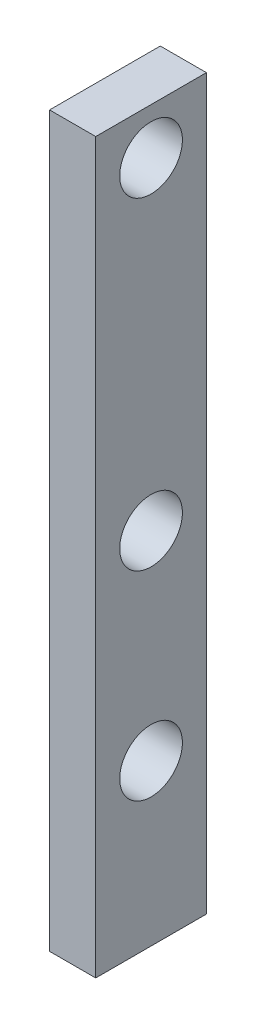
ISO-10303-21;
HEADER;
FILE_DESCRIPTION(('STEP AP214'),'2;1');
FILE_NAME('part.step','',(''),(''),'','','');
FILE_SCHEMA(('AUTOMOTIVE_DESIGN { 1 0 10303 214 1 1 1 1 }'));
ENDSEC;
DATA;
#1=APPLICATION_CONTEXT('core data for automotive mechanical design processes');
#2=APPLICATION_PROTOCOL_DEFINITION('international standard','automotive_design',2000,#1);
#3=PRODUCT_CONTEXT('',#1,'mechanical');
#4=PRODUCT('Part','Part','',(#3));
#5=PRODUCT_RELATED_PRODUCT_CATEGORY('part','',(#4));
#6=PRODUCT_DEFINITION_FORMATION('','',#4);
#7=PRODUCT_DEFINITION_CONTEXT('part definition',#1,'design');
#8=PRODUCT_DEFINITION('design','',#6,#7);
#9=PRODUCT_DEFINITION_SHAPE('','',#8);
#10=(LENGTH_UNIT() NAMED_UNIT(*) SI_UNIT(.MILLI.,.METRE.));
#11=(NAMED_UNIT(*) PLANE_ANGLE_UNIT() SI_UNIT($,.RADIAN.));
#12=(NAMED_UNIT(*) SI_UNIT($,.STERADIAN.) SOLID_ANGLE_UNIT());
#13=UNCERTAINTY_MEASURE_WITH_UNIT(LENGTH_MEASURE(1.E-05),#10,'distance_accuracy_value','');
#14=(GEOMETRIC_REPRESENTATION_CONTEXT(3) GLOBAL_UNCERTAINTY_ASSIGNED_CONTEXT((#13)) GLOBAL_UNIT_ASSIGNED_CONTEXT((#10,
#11,#12)) REPRESENTATION_CONTEXT('',''));
#15=CARTESIAN_POINT('',(0.,0.,0.));
#16=DIRECTION('',(0.,0.,1.));
#17=DIRECTION('',(1.,0.,0.));
#18=AXIS2_PLACEMENT_3D('',#15,#16,#17);
#19=CARTESIAN_POINT('',(2.5,0.,0.));
#20=DIRECTION('',(-1.,0.,0.));
#21=DIRECTION('',(0.,0.,1.));
#22=AXIS2_PLACEMENT_3D('',#19,#20,#21);
#23=PLANE('',#22);
#24=DIRECTION('',(0.,-1.,0.));
#25=VECTOR('',#24,1.);
#26=CARTESIAN_POINT('',(2.5,0.,0.));
#27=LINE('',#26,#25);
#28=CARTESIAN_POINT('',(2.5,39.5,0.));
#29=VERTEX_POINT('',#28);
#30=CARTESIAN_POINT('',(2.5,0.,0.));
#31=VERTEX_POINT('',#30);
#32=EDGE_CURVE('E91',#29,#31,#27,.T.);
#33=ORIENTED_EDGE('',*,*,#32,.T.);
#34=DIRECTION('',(0.,0.,-1.));
#35=VECTOR('',#34,1.);
#36=CARTESIAN_POINT('',(2.5,0.,0.));
#37=LINE('',#36,#35);
#38=CARTESIAN_POINT('',(2.5,0.,-6.));
#39=VERTEX_POINT('',#38);
#40=EDGE_CURVE('E86',#31,#39,#37,.T.);
#41=ORIENTED_EDGE('',*,*,#40,.T.);
#42=DIRECTION('',(0.,1.,0.));
#43=VECTOR('',#42,1.);
#44=CARTESIAN_POINT('',(2.5,0.,-6.));
#45=LINE('',#44,#43);
#46=CARTESIAN_POINT('',(2.5,39.5,-6.));
#47=VERTEX_POINT('',#46);
#48=EDGE_CURVE('E89',#39,#47,#45,.T.);
#49=ORIENTED_EDGE('',*,*,#48,.T.);
#50=DIRECTION('',(0.,0.,1.));
#51=VECTOR('',#50,1.);
#52=CARTESIAN_POINT('',(2.5,39.5,0.));
#53=LINE('',#52,#51);
#54=EDGE_CURVE('E56',#47,#29,#53,.T.);
#55=ORIENTED_EDGE('',*,*,#54,.T.);
#56=EDGE_LOOP('',(#33,#41,#49,#55));
#57=FACE_BOUND('',#56,.T.);
#58=CARTESIAN_POINT('',(2.5,8.7,-3.));
#59=DIRECTION('',(1.,0.,0.));
#60=DIRECTION('',(0.,0.,-1.));
#61=AXIS2_PLACEMENT_3D('',#58,#59,#60);
#62=CIRCLE('',#61,1.7);
#63=CARTESIAN_POINT('',(2.5,8.7,-4.7));
#64=VERTEX_POINT('',#63);
#65=EDGE_CURVE('E106',#64,#64,#62,.T.);
#66=ORIENTED_EDGE('',*,*,#65,.F.);
#67=EDGE_LOOP('',(#66));
#68=FACE_BOUND('',#67,.T.);
#69=CARTESIAN_POINT('',(2.5,19.5,-3.));
#70=DIRECTION('',(1.,0.,0.));
#71=DIRECTION('',(0.,0.,-1.));
#72=AXIS2_PLACEMENT_3D('',#69,#70,#71);
#73=CIRCLE('',#72,1.7);
#74=CARTESIAN_POINT('',(2.5,19.5,-4.7));
#75=VERTEX_POINT('',#74);
#76=EDGE_CURVE('E121',#75,#75,#73,.T.);
#77=ORIENTED_EDGE('',*,*,#76,.F.);
#78=EDGE_LOOP('',(#77));
#79=FACE_BOUND('',#78,.T.);
#80=CARTESIAN_POINT('',(2.5,37.,-3.));
#81=DIRECTION('',(1.,0.,0.));
#82=DIRECTION('',(0.,0.,-1.));
#83=AXIS2_PLACEMENT_3D('',#80,#81,#82);
#84=CIRCLE('',#83,1.7);
#85=CARTESIAN_POINT('',(2.5,37.,-4.7));
#86=VERTEX_POINT('',#85);
#87=EDGE_CURVE('E127',#86,#86,#84,.T.);
#88=ORIENTED_EDGE('',*,*,#87,.F.);
#89=EDGE_LOOP('',(#88));
#90=FACE_BOUND('',#89,.T.);
#91=ADVANCED_FACE('F39',(#57,#68,#79,#90),#23,.F.);
#92=CARTESIAN_POINT('',(0.,0.,0.));
#93=DIRECTION('',(-1.,0.,0.));
#94=DIRECTION('',(0.,0.,1.));
#95=AXIS2_PLACEMENT_3D('',#92,#93,#94);
#96=PLANE('',#95);
#97=CARTESIAN_POINT('',(0.,19.5,-3.));
#98=DIRECTION('',(1.,0.,0.));
#99=DIRECTION('',(0.,0.,-1.));
#100=AXIS2_PLACEMENT_3D('',#97,#98,#99);
#101=CIRCLE('',#100,1.7);
#102=CARTESIAN_POINT('',(0.,19.5,-4.7));
#103=VERTEX_POINT('',#102);
#104=EDGE_CURVE('E124',#103,#103,#101,.T.);
#105=ORIENTED_EDGE('',*,*,#104,.T.);
#106=EDGE_LOOP('',(#105));
#107=FACE_BOUND('',#106,.T.);
#108=DIRECTION('',(0.,-1.,0.));
#109=VECTOR('',#108,1.);
#110=CARTESIAN_POINT('',(0.,0.,0.));
#111=LINE('',#110,#109);
#112=CARTESIAN_POINT('',(0.,39.5,0.));
#113=VERTEX_POINT('',#112);
#114=CARTESIAN_POINT('',(0.,0.,0.));
#115=VERTEX_POINT('',#114);
#116=EDGE_CURVE('E103',#113,#115,#111,.T.);
#117=ORIENTED_EDGE('',*,*,#116,.F.);
#118=DIRECTION('',(0.,0.,1.));
#119=VECTOR('',#118,1.);
#120=CARTESIAN_POINT('',(0.,39.5,0.));
#121=LINE('',#120,#119);
#122=CARTESIAN_POINT('',(0.,39.5,-6.));
#123=VERTEX_POINT('',#122);
#124=EDGE_CURVE('E79',#123,#113,#121,.T.);
#125=ORIENTED_EDGE('',*,*,#124,.F.);
#126=DIRECTION('',(0.,1.,0.));
#127=VECTOR('',#126,1.);
#128=CARTESIAN_POINT('',(0.,0.,-6.));
#129=LINE('',#128,#127);
#130=CARTESIAN_POINT('',(0.,0.,-6.));
#131=VERTEX_POINT('',#130);
#132=EDGE_CURVE('E73',#131,#123,#129,.T.);
#133=ORIENTED_EDGE('',*,*,#132,.F.);
#134=DIRECTION('',(0.,0.,-1.));
#135=VECTOR('',#134,1.);
#136=CARTESIAN_POINT('',(0.,0.,0.));
#137=LINE('',#136,#135);
#138=EDGE_CURVE('E95',#115,#131,#137,.T.);
#139=ORIENTED_EDGE('',*,*,#138,.F.);
#140=EDGE_LOOP('',(#117,#125,#133,#139));
#141=FACE_BOUND('',#140,.T.);
#142=CARTESIAN_POINT('',(0.,8.7,-3.));
#143=DIRECTION('',(1.,0.,0.));
#144=DIRECTION('',(0.,0.,-1.));
#145=AXIS2_PLACEMENT_3D('',#142,#143,#144);
#146=CIRCLE('',#145,1.7);
#147=CARTESIAN_POINT('',(0.,8.7,-4.7));
#148=VERTEX_POINT('',#147);
#149=EDGE_CURVE('E118',#148,#148,#146,.T.);
#150=ORIENTED_EDGE('',*,*,#149,.T.);
#151=EDGE_LOOP('',(#150));
#152=FACE_BOUND('',#151,.T.);
#153=CARTESIAN_POINT('',(0.,37.,-3.));
#154=DIRECTION('',(1.,0.,0.));
#155=DIRECTION('',(0.,0.,-1.));
#156=AXIS2_PLACEMENT_3D('',#153,#154,#155);
#157=CIRCLE('',#156,1.7);
#158=CARTESIAN_POINT('',(0.,37.,-4.7));
#159=VERTEX_POINT('',#158);
#160=EDGE_CURVE('E130',#159,#159,#157,.T.);
#161=ORIENTED_EDGE('',*,*,#160,.T.);
#162=EDGE_LOOP('',(#161));
#163=FACE_BOUND('',#162,.T.);
#164=ADVANCED_FACE('F114',(#107,#141,#152,#163),#96,.T.);
#165=CARTESIAN_POINT('',(2.5,0.,0.));
#166=DIRECTION('',(0.,0.,-1.));
#167=DIRECTION('',(-1.,0.,0.));
#168=AXIS2_PLACEMENT_3D('',#165,#166,#167);
#169=PLANE('',#168);
#170=ORIENTED_EDGE('',*,*,#116,.T.);
#171=DIRECTION('',(-1.,0.,0.));
#172=VECTOR('',#171,1.);
#173=CARTESIAN_POINT('',(2.5,0.,0.));
#174=LINE('',#173,#172);
#175=EDGE_CURVE('E11',#31,#115,#174,.T.);
#176=ORIENTED_EDGE('',*,*,#175,.F.);
#177=ORIENTED_EDGE('',*,*,#32,.F.);
#178=DIRECTION('',(-1.,0.,0.));
#179=VECTOR('',#178,1.);
#180=CARTESIAN_POINT('',(2.5,39.5,0.));
#181=LINE('',#180,#179);
#182=EDGE_CURVE('E99',#29,#113,#181,.T.);
#183=ORIENTED_EDGE('',*,*,#182,.T.);
#184=EDGE_LOOP('',(#170,#176,#177,#183));
#185=FACE_BOUND('',#184,.T.);
#186=ADVANCED_FACE('F41',(#185),#169,.F.);
#187=CARTESIAN_POINT('',(2.5,0.,0.));
#188=DIRECTION('',(0.,1.,0.));
#189=DIRECTION('',(0.,0.,1.));
#190=AXIS2_PLACEMENT_3D('',#187,#188,#189);
#191=PLANE('',#190);
#192=ORIENTED_EDGE('',*,*,#138,.T.);
#193=DIRECTION('',(-1.,0.,0.));
#194=VECTOR('',#193,1.);
#195=CARTESIAN_POINT('',(2.5,0.,-6.));
#196=LINE('',#195,#194);
#197=EDGE_CURVE('E48',#39,#131,#196,.T.);
#198=ORIENTED_EDGE('',*,*,#197,.F.);
#199=ORIENTED_EDGE('',*,*,#40,.F.);
#200=ORIENTED_EDGE('',*,*,#175,.T.);
#201=EDGE_LOOP('',(#192,#198,#199,#200));
#202=FACE_BOUND('',#201,.T.);
#203=ADVANCED_FACE('F94',(#202),#191,.F.);
#204=CARTESIAN_POINT('',(2.5,0.,-6.));
#205=DIRECTION('',(0.,0.,1.));
#206=DIRECTION('',(1.,0.,0.));
#207=AXIS2_PLACEMENT_3D('',#204,#205,#206);
#208=PLANE('',#207);
#209=ORIENTED_EDGE('',*,*,#132,.T.);
#210=DIRECTION('',(-1.,0.,0.));
#211=VECTOR('',#210,1.);
#212=CARTESIAN_POINT('',(2.5,39.5,-6.));
#213=LINE('',#212,#211);
#214=EDGE_CURVE('E96',#47,#123,#213,.T.);
#215=ORIENTED_EDGE('',*,*,#214,.F.);
#216=ORIENTED_EDGE('',*,*,#48,.F.);
#217=ORIENTED_EDGE('',*,*,#197,.T.);
#218=EDGE_LOOP('',(#209,#215,#216,#217));
#219=FACE_BOUND('',#218,.T.);
#220=ADVANCED_FACE('F97',(#219),#208,.F.);
#221=CARTESIAN_POINT('',(2.5,39.5,0.));
#222=DIRECTION('',(0.,-1.,0.));
#223=DIRECTION('',(0.,0.,-1.));
#224=AXIS2_PLACEMENT_3D('',#221,#222,#223);
#225=PLANE('',#224);
#226=ORIENTED_EDGE('',*,*,#124,.T.);
#227=ORIENTED_EDGE('',*,*,#182,.F.);
#228=ORIENTED_EDGE('',*,*,#54,.F.);
#229=ORIENTED_EDGE('',*,*,#214,.T.);
#230=EDGE_LOOP('',(#226,#227,#228,#229));
#231=FACE_BOUND('',#230,.T.);
#232=ADVANCED_FACE('F111',(#231),#225,.F.);
#233=CARTESIAN_POINT('',(2.5,8.7,-3.));
#234=DIRECTION('',(-1.,0.,0.));
#235=DIRECTION('',(0.,0.,1.));
#236=AXIS2_PLACEMENT_3D('',#233,#234,#235);
#237=CYLINDRICAL_SURFACE('',#236,1.7);
#238=ORIENTED_EDGE('',*,*,#65,.T.);
#239=EDGE_LOOP('',(#238));
#240=FACE_BOUND('',#239,.T.);
#241=ORIENTED_EDGE('',*,*,#149,.F.);
#242=EDGE_LOOP('',(#241));
#243=FACE_BOUND('',#242,.T.);
#244=ADVANCED_FACE('F147',(#240,#243),#237,.F.);
#245=CARTESIAN_POINT('',(2.5,19.5,-3.));
#246=DIRECTION('',(-1.,0.,0.));
#247=DIRECTION('',(0.,0.,1.));
#248=AXIS2_PLACEMENT_3D('',#245,#246,#247);
#249=CYLINDRICAL_SURFACE('',#248,1.7);
#250=ORIENTED_EDGE('',*,*,#76,.T.);
#251=EDGE_LOOP('',(#250));
#252=FACE_BOUND('',#251,.T.);
#253=ORIENTED_EDGE('',*,*,#104,.F.);
#254=EDGE_LOOP('',(#253));
#255=FACE_BOUND('',#254,.T.);
#256=ADVANCED_FACE('F192',(#252,#255),#249,.F.);
#257=CARTESIAN_POINT('',(2.5,37.,-3.));
#258=DIRECTION('',(-1.,0.,0.));
#259=DIRECTION('',(0.,0.,1.));
#260=AXIS2_PLACEMENT_3D('',#257,#258,#259);
#261=CYLINDRICAL_SURFACE('',#260,1.7);
#262=ORIENTED_EDGE('',*,*,#87,.T.);
#263=EDGE_LOOP('',(#262));
#264=FACE_BOUND('',#263,.T.);
#265=ORIENTED_EDGE('',*,*,#160,.F.);
#266=EDGE_LOOP('',(#265));
#267=FACE_BOUND('',#266,.T.);
#268=ADVANCED_FACE('F136',(#264,#267),#261,.F.);
#269=CLOSED_SHELL('',(#91,#164,#186,#203,#220,#232,#244,#256,#268));
#270=MANIFOLD_SOLID_BREP('B2',#269);
#271=ADVANCED_BREP_SHAPE_REPRESENTATION('',(#18,#270),#14);
#272=SHAPE_DEFINITION_REPRESENTATION(#9,#271);
ENDSEC;
END-ISO-10303-21;
